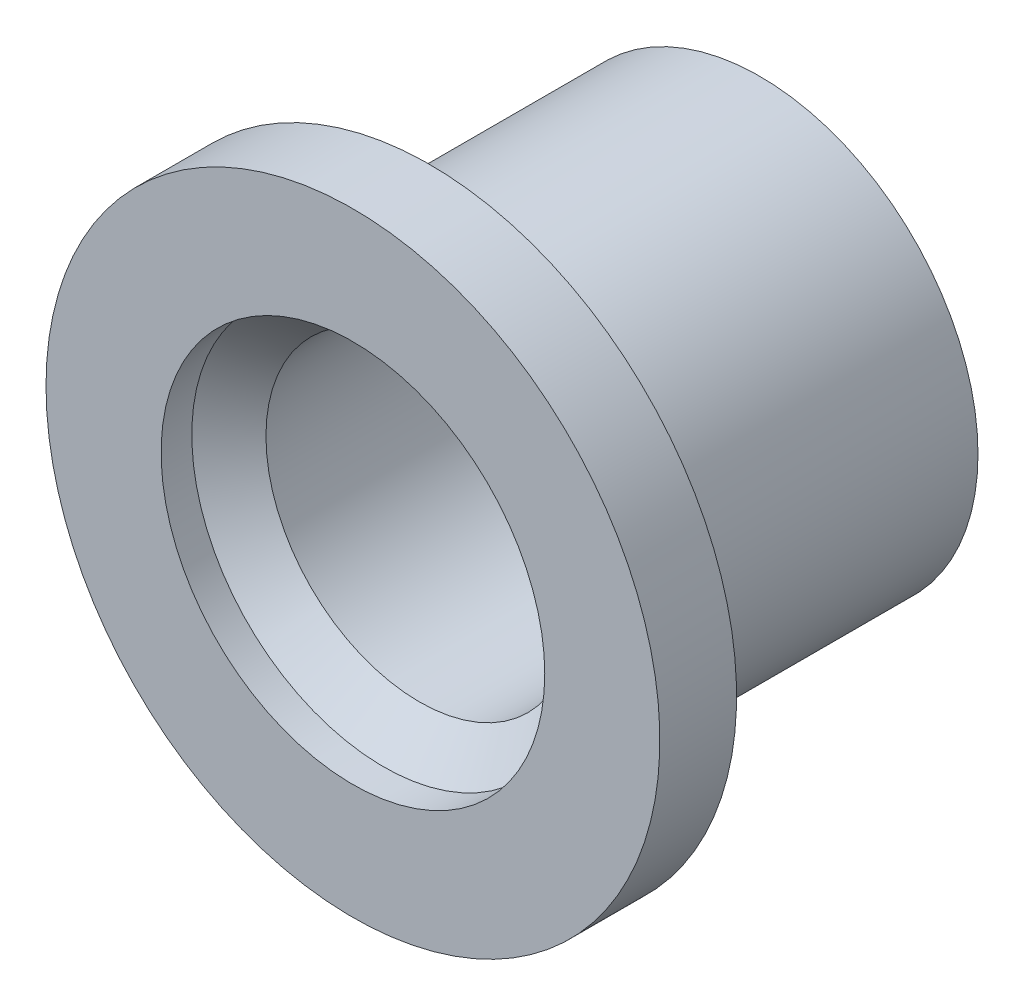
ISO-10303-21;
HEADER;
FILE_DESCRIPTION(('STEP AP214'),'2;1');
FILE_NAME('part.step','',(''),(''),'','','');
FILE_SCHEMA(('AUTOMOTIVE_DESIGN { 1 0 10303 214 1 1 1 1 }'));
ENDSEC;
DATA;
#1=APPLICATION_CONTEXT('core data for automotive mechanical design processes');
#2=APPLICATION_PROTOCOL_DEFINITION('international standard','automotive_design',2000,#1);
#3=PRODUCT_CONTEXT('',#1,'mechanical');
#4=PRODUCT('Part','Part','',(#3));
#5=PRODUCT_RELATED_PRODUCT_CATEGORY('part','',(#4));
#6=PRODUCT_DEFINITION_FORMATION('','',#4);
#7=PRODUCT_DEFINITION_CONTEXT('part definition',#1,'design');
#8=PRODUCT_DEFINITION('design','',#6,#7);
#9=PRODUCT_DEFINITION_SHAPE('','',#8);
#10=(LENGTH_UNIT() NAMED_UNIT(*) SI_UNIT(.MILLI.,.METRE.));
#11=(NAMED_UNIT(*) PLANE_ANGLE_UNIT() SI_UNIT($,.RADIAN.));
#12=(NAMED_UNIT(*) SI_UNIT($,.STERADIAN.) SOLID_ANGLE_UNIT());
#13=UNCERTAINTY_MEASURE_WITH_UNIT(LENGTH_MEASURE(1.E-05),#10,'distance_accuracy_value','');
#14=(GEOMETRIC_REPRESENTATION_CONTEXT(3) GLOBAL_UNCERTAINTY_ASSIGNED_CONTEXT((#13)) GLOBAL_UNIT_ASSIGNED_CONTEXT((#10,
#11,#12)) REPRESENTATION_CONTEXT('',''));
#15=CARTESIAN_POINT('',(0.,0.,0.));
#16=DIRECTION('',(0.,0.,1.));
#17=DIRECTION('',(1.,0.,0.));
#18=AXIS2_PLACEMENT_3D('',#15,#16,#17);
#19=CARTESIAN_POINT('',(0.,0.,0.));
#20=DIRECTION('',(0.,0.,1.));
#21=DIRECTION('',(1.,0.,0.));
#22=AXIS2_PLACEMENT_3D('',#19,#20,#21);
#23=PLANE('',#22);
#24=CARTESIAN_POINT('',(0.,0.,0.));
#25=DIRECTION('',(0.,0.,1.));
#26=DIRECTION('',(1.,0.,0.));
#27=AXIS2_PLACEMENT_3D('',#24,#25,#26);
#28=CIRCLE('',#27,5.08);
#29=CARTESIAN_POINT('',(-5.08,0.,0.));
#30=VERTEX_POINT('',#29);
#31=EDGE_CURVE('E48',#30,#30,#28,.T.);
#32=ORIENTED_EDGE('',*,*,#31,.F.);
#33=EDGE_LOOP('',(#32));
#34=FACE_BOUND('',#33,.T.);
#35=CARTESIAN_POINT('',(0.,0.,0.));
#36=DIRECTION('',(0.,0.,1.));
#37=DIRECTION('',(1.,0.,0.));
#38=AXIS2_PLACEMENT_3D('',#35,#36,#37);
#39=CIRCLE('',#38,3.60939766381894);
#40=CARTESIAN_POINT('',(3.60939766381894,0.,0.));
#41=VERTEX_POINT('',#40);
#42=EDGE_CURVE('E11',#41,#41,#39,.F.);
#43=ORIENTED_EDGE('',*,*,#42,.F.);
#44=EDGE_LOOP('',(#43));
#45=FACE_BOUND('',#44,.T.);
#46=ADVANCED_FACE('F33',(#34,#45),#23,.F.);
#47=CARTESIAN_POINT('',(0.,0.,0.762));
#48=DIRECTION('',(0.,0.,-1.));
#49=DIRECTION('',(-1.,0.,0.));
#50=AXIS2_PLACEMENT_3D('',#47,#48,#49);
#51=CYLINDRICAL_SURFACE('',#50,5.08);
#52=CARTESIAN_POINT('',(0.,0.,1.27));
#53=DIRECTION('',(0.,0.,1.));
#54=DIRECTION('',(1.,0.,0.));
#55=AXIS2_PLACEMENT_3D('',#52,#53,#54);
#56=CIRCLE('',#55,5.08);
#57=CARTESIAN_POINT('',(-5.08,0.,1.27));
#58=VERTEX_POINT('',#57);
#59=EDGE_CURVE('E53',#58,#58,#56,.T.);
#60=CARTESIAN_POINT('',(-5.08,0.,0.));
#61=CARTESIAN_POINT('',(-5.08,0.,0.0132291666666667));
#62=CARTESIAN_POINT('',(-5.08,0.,0.0264583333333333));
#63=CARTESIAN_POINT('',(-5.08,0.,0.0529166666666667));
#64=CARTESIAN_POINT('',(-5.08,0.,0.0661458333333333));
#65=CARTESIAN_POINT('',(-5.08,0.,0.0926041666666667));
#66=CARTESIAN_POINT('',(-5.08,0.,0.105833333333333));
#67=CARTESIAN_POINT('',(-5.08,0.,0.132291666666667));
#68=CARTESIAN_POINT('',(-5.08,0.,0.145520833333333));
#69=CARTESIAN_POINT('',(-5.08,0.,0.171979166666667));
#70=CARTESIAN_POINT('',(-5.08,0.,0.185208333333333));
#71=CARTESIAN_POINT('',(-5.08,0.,0.211666666666667));
#72=CARTESIAN_POINT('',(-5.08,0.,0.224895833333333));
#73=CARTESIAN_POINT('',(-5.08,0.,0.251354166666667));
#74=CARTESIAN_POINT('',(-5.08,0.,0.264583333333333));
#75=CARTESIAN_POINT('',(-5.08,0.,0.291041666666667));
#76=CARTESIAN_POINT('',(-5.08,0.,0.304270833333333));
#77=CARTESIAN_POINT('',(-5.08,0.,0.330729166666667));
#78=CARTESIAN_POINT('',(-5.08,0.,0.343958333333333));
#79=CARTESIAN_POINT('',(-5.08,0.,0.370416666666667));
#80=CARTESIAN_POINT('',(-5.08,0.,0.383645833333333));
#81=CARTESIAN_POINT('',(-5.08,0.,0.410104166666667));
#82=CARTESIAN_POINT('',(-5.08,0.,0.423333333333333));
#83=CARTESIAN_POINT('',(-5.08,0.,0.449791666666667));
#84=CARTESIAN_POINT('',(-5.08,0.,0.463020833333333));
#85=CARTESIAN_POINT('',(-5.08,0.,0.489479166666667));
#86=CARTESIAN_POINT('',(-5.08,0.,0.502708333333333));
#87=CARTESIAN_POINT('',(-5.08,0.,0.529166666666666));
#88=CARTESIAN_POINT('',(-5.08,0.,0.542395833333333));
#89=CARTESIAN_POINT('',(-5.08,0.,0.568854166666667));
#90=CARTESIAN_POINT('',(-5.08,0.,0.582083333333333));
#91=CARTESIAN_POINT('',(-5.08,0.,0.608541666666667));
#92=CARTESIAN_POINT('',(-5.08,0.,0.621770833333333));
#93=CARTESIAN_POINT('',(-5.08,0.,0.648229166666667));
#94=CARTESIAN_POINT('',(-5.08,0.,0.661458333333333));
#95=CARTESIAN_POINT('',(-5.08,0.,0.687916666666667));
#96=CARTESIAN_POINT('',(-5.08,0.,0.701145833333333));
#97=CARTESIAN_POINT('',(-5.08,0.,0.727604166666666));
#98=CARTESIAN_POINT('',(-5.08,0.,0.740833333333333));
#99=CARTESIAN_POINT('',(-5.08,0.,0.767291666666667));
#100=CARTESIAN_POINT('',(-5.08,0.,0.780520833333333));
#101=CARTESIAN_POINT('',(-5.08,0.,0.806979166666666));
#102=CARTESIAN_POINT('',(-5.08,0.,0.820208333333333));
#103=CARTESIAN_POINT('',(-5.08,0.,0.846666666666666));
#104=CARTESIAN_POINT('',(-5.08,0.,0.859895833333333));
#105=CARTESIAN_POINT('',(-5.08,0.,0.886354166666666));
#106=CARTESIAN_POINT('',(-5.08,0.,0.899583333333333));
#107=CARTESIAN_POINT('',(-5.08,0.,0.926041666666666));
#108=CARTESIAN_POINT('',(-5.08,0.,0.939270833333333));
#109=CARTESIAN_POINT('',(-5.08,0.,0.965729166666666));
#110=CARTESIAN_POINT('',(-5.08,0.,0.978958333333333));
#111=CARTESIAN_POINT('',(-5.08,0.,1.00541666666667));
#112=CARTESIAN_POINT('',(-5.08,0.,1.01864583333333));
#113=CARTESIAN_POINT('',(-5.08,0.,1.04510416666667));
#114=CARTESIAN_POINT('',(-5.08,0.,1.05833333333333));
#115=CARTESIAN_POINT('',(-5.08,0.,1.08479166666667));
#116=CARTESIAN_POINT('',(-5.08,0.,1.09802083333333));
#117=CARTESIAN_POINT('',(-5.08,0.,1.12447916666667));
#118=CARTESIAN_POINT('',(-5.08,0.,1.13770833333333));
#119=CARTESIAN_POINT('',(-5.08,0.,1.16416666666667));
#120=CARTESIAN_POINT('',(-5.08,0.,1.17739583333333));
#121=CARTESIAN_POINT('',(-5.08,0.,1.20385416666667));
#122=CARTESIAN_POINT('',(-5.08,0.,1.21708333333333));
#123=CARTESIAN_POINT('',(-5.08,0.,1.24354166666667));
#124=CARTESIAN_POINT('',(-5.08,0.,1.25677083333333));
#125=CARTESIAN_POINT('',(-5.08,0.,1.27));
#126=B_SPLINE_CURVE_WITH_KNOTS('',3,(#60,#61,#62,#63,#64,#65,#66,#67,#68,#69,#70,#71,#72,#73,
#74,#75,#76,#77,#78,#79,#80,#81,#82,#83,#84,#85,#86,#87,#88,#89,#90,#91,#92,#93,#94,#95,#96,#97,
#98,#99,#100,#101,#102,#103,#104,#105,#106,#107,#108,#109,#110,#111,#112,#113,#114,#115,#116,
#117,#118,#119,#120,#121,#122,#123,#124,#125),.UNSPECIFIED.,.F.,.F.,(4,2,2,2,2,2,2,2,2,2,2,2,2,
2,2,2,2,2,2,2,2,2,2,2,2,2,2,2,2,2,2,2,4),(0.,0.0396875,0.079375,0.1190625,0.15875,0.1984375,
0.238125,0.2778125,0.3175,0.3571875,0.396875,0.4365625,0.47625,0.5159375,0.555625,0.5953125,
0.635,0.6746875,0.714375,0.7540625,0.79375,0.8334375,0.873125,0.9128125,0.9525,0.9921875,
1.031875,1.0715625,1.11125,1.1509375,1.190625,1.2303125,1.27),.UNSPECIFIED.);
#127=EDGE_CURVE('BSEAM79',#30,#58,#126,.T.);
#128=ORIENTED_EDGE('',*,*,#31,.T.);
#129=ORIENTED_EDGE('',*,*,#59,.F.);
#130=ORIENTED_EDGE('',*,*,#127,.T.);
#131=ORIENTED_EDGE('',*,*,#127,.F.);
#132=EDGE_LOOP('',(#128,#130,#129,#131));
#133=FACE_BOUND('',#132,.T.);
#134=ADVANCED_FACE('F79',(#133),#51,.T.);
#135=CARTESIAN_POINT('',(0.,0.,0.762));
#136=DIRECTION('',(0.,0.,-1.));
#137=DIRECTION('',(-1.,0.,0.));
#138=AXIS2_PLACEMENT_3D('',#135,#136,#137);
#139=CYLINDRICAL_SURFACE('',#138,2.54);
#140=CARTESIAN_POINT('',(0.,0.,0.169852920302577));
#141=DIRECTION('',(0.,0.,1.));
#142=DIRECTION('',(1.,0.,0.));
#143=AXIS2_PLACEMENT_3D('',#140,#141,#142);
#144=CIRCLE('',#143,2.54);
#145=CARTESIAN_POINT('',(-2.54,0.,0.169852920302577));
#146=VERTEX_POINT('',#145);
#147=EDGE_CURVE('E44',#146,#146,#144,.T.);
#148=CARTESIAN_POINT('',(0.,0.,-5.46608));
#149=DIRECTION('',(0.,0.,1.));
#150=DIRECTION('',(1.,0.,0.));
#151=AXIS2_PLACEMENT_3D('',#148,#149,#150);
#152=CIRCLE('',#151,2.54);
#153=CARTESIAN_POINT('',(-2.54,0.,-5.46608));
#154=VERTEX_POINT('',#153);
#155=EDGE_CURVE('E59',#154,#154,#152,.T.);
#156=CARTESIAN_POINT('',(-2.54,0.,0.169852920302577));
#157=CARTESIAN_POINT('',(-2.54,0.,0.111145285716092));
#158=CARTESIAN_POINT('',(-2.54,0.,0.0524376511296068));
#159=CARTESIAN_POINT('',(-2.54,0.,-0.0649776180433636));
#160=CARTESIAN_POINT('',(-2.54,0.,-0.123685252629849));
#161=CARTESIAN_POINT('',(-2.54,0.,-0.241100521802819));
#162=CARTESIAN_POINT('',(-2.54,0.,-0.299808156389304));
#163=CARTESIAN_POINT('',(-2.54,0.,-0.417223425562275));
#164=CARTESIAN_POINT('',(-2.54,0.,-0.47593106014876));
#165=CARTESIAN_POINT('',(-2.54,0.,-0.593346329321731));
#166=CARTESIAN_POINT('',(-2.54,0.,-0.652053963908216));
#167=CARTESIAN_POINT('',(-2.54,0.,-0.769469233081186));
#168=CARTESIAN_POINT('',(-2.54,0.,-0.828176867667671));
#169=CARTESIAN_POINT('',(-2.54,0.,-0.945592136840642));
#170=CARTESIAN_POINT('',(-2.54,0.,-1.00429977142713));
#171=CARTESIAN_POINT('',(-2.54,0.,-1.1217150406001));
#172=CARTESIAN_POINT('',(-2.54,0.,-1.18042267518658));
#173=CARTESIAN_POINT('',(-2.54,0.,-1.29783794435955));
#174=CARTESIAN_POINT('',(-2.54,0.,-1.35654557894604));
#175=CARTESIAN_POINT('',(-2.54,0.,-1.47396084811901));
#176=CARTESIAN_POINT('',(-2.54,0.,-1.53266848270549));
#177=CARTESIAN_POINT('',(-2.54,0.,-1.65008375187846));
#178=CARTESIAN_POINT('',(-2.54,0.,-1.70879138646495));
#179=CARTESIAN_POINT('',(-2.54,0.,-1.82620665563792));
#180=CARTESIAN_POINT('',(-2.54,0.,-1.88491429022441));
#181=CARTESIAN_POINT('',(-2.54,0.,-2.00232955939738));
#182=CARTESIAN_POINT('',(-2.54,0.,-2.06103719398386));
#183=CARTESIAN_POINT('',(-2.54,0.,-2.17845246315683));
#184=CARTESIAN_POINT('',(-2.54,0.,-2.23716009774332));
#185=CARTESIAN_POINT('',(-2.54,0.,-2.35457536691629));
#186=CARTESIAN_POINT('',(-2.54,0.,-2.41328300150277));
#187=CARTESIAN_POINT('',(-2.54,0.,-2.53069827067574));
#188=CARTESIAN_POINT('',(-2.54,0.,-2.58940590526223));
#189=CARTESIAN_POINT('',(-2.54,0.,-2.7068211744352));
#190=CARTESIAN_POINT('',(-2.54,0.,-2.76552880902168));
#191=CARTESIAN_POINT('',(-2.54,0.,-2.88294407819465));
#192=CARTESIAN_POINT('',(-2.54,0.,-2.94165171278114));
#193=CARTESIAN_POINT('',(-2.54,0.,-3.05906698195411));
#194=CARTESIAN_POINT('',(-2.54,0.,-3.11777461654059));
#195=CARTESIAN_POINT('',(-2.54,0.,-3.23518988571356));
#196=CARTESIAN_POINT('',(-2.54,0.,-3.29389752030005));
#197=CARTESIAN_POINT('',(-2.54,0.,-3.41131278947302));
#198=CARTESIAN_POINT('',(-2.54,0.,-3.47002042405951));
#199=CARTESIAN_POINT('',(-2.54,0.,-3.58743569323248));
#200=CARTESIAN_POINT('',(-2.54,0.,-3.64614332781896));
#201=CARTESIAN_POINT('',(-2.54,0.,-3.76355859699193));
#202=CARTESIAN_POINT('',(-2.54,0.,-3.82226623157842));
#203=CARTESIAN_POINT('',(-2.54,0.,-3.93968150075139));
#204=CARTESIAN_POINT('',(-2.54,0.,-3.99838913533787));
#205=CARTESIAN_POINT('',(-2.54,0.,-4.11580440451084));
#206=CARTESIAN_POINT('',(-2.54,0.,-4.17451203909733));
#207=CARTESIAN_POINT('',(-2.54,0.,-4.2919273082703));
#208=CARTESIAN_POINT('',(-2.54,0.,-4.35063494285678));
#209=CARTESIAN_POINT('',(-2.54,0.,-4.46805021202975));
#210=CARTESIAN_POINT('',(-2.54,0.,-4.52675784661624));
#211=CARTESIAN_POINT('',(-2.54,0.,-4.64417311578921));
#212=CARTESIAN_POINT('',(-2.54,0.,-4.7028807503757));
#213=CARTESIAN_POINT('',(-2.54,0.,-4.82029601954867));
#214=CARTESIAN_POINT('',(-2.54,0.,-4.87900365413515));
#215=CARTESIAN_POINT('',(-2.54,0.,-4.99641892330812));
#216=CARTESIAN_POINT('',(-2.54,0.,-5.05512655789461));
#217=CARTESIAN_POINT('',(-2.54,0.,-5.17254182706758));
#218=CARTESIAN_POINT('',(-2.54,0.,-5.23124946165406));
#219=CARTESIAN_POINT('',(-2.54,0.,-5.34866473082703));
#220=CARTESIAN_POINT('',(-2.54,0.,-5.40737236541352));
#221=CARTESIAN_POINT('',(-2.54,0.,-5.46608));
#222=B_SPLINE_CURVE_WITH_KNOTS('',3,(#156,#157,#158,#159,#160,#161,#162,#163,#164,#165,#166,
#167,#168,#169,#170,#171,#172,#173,#174,#175,#176,#177,#178,#179,#180,#181,#182,#183,#184,#185,
#186,#187,#188,#189,#190,#191,#192,#193,#194,#195,#196,#197,#198,#199,#200,#201,#202,#203,#204,
#205,#206,#207,#208,#209,#210,#211,#212,#213,#214,#215,#216,#217,#218,#219,#220,#221),
.UNSPECIFIED.,.F.,.F.,(4,2,2,2,2,2,2,2,2,2,2,2,2,2,2,2,2,2,2,2,2,2,2,2,2,2,2,2,2,2,2,2,4),(0.,
0.176122903759456,0.352245807518911,0.528368711278367,0.704491615037823,0.880614518797278,
1.05673742255673,1.23286032631619,1.40898323007564,1.5851061338351,1.76122903759456,
1.93735194135401,2.11347484511347,2.28959774887292,2.46572065263238,2.64184355639183,
2.81796646015129,2.99408936391075,3.1702122676702,3.34633517142966,3.52245807518911,
3.69858097894857,3.87470388270802,4.05082678646748,4.22694969022694,4.40307259398639,
4.57919549774585,4.7553184015053,4.93144130526476,5.10756420902421,5.28368711278367,
5.45981001654312,5.63593292030258),.UNSPECIFIED.);
#223=EDGE_CURVE('BSEAM87',#146,#154,#222,.T.);
#224=ORIENTED_EDGE('',*,*,#147,.T.);
#225=ORIENTED_EDGE('',*,*,#155,.F.);
#226=ORIENTED_EDGE('',*,*,#223,.T.);
#227=ORIENTED_EDGE('',*,*,#223,.F.);
#228=EDGE_LOOP('',(#224,#226,#225,#227));
#229=FACE_BOUND('',#228,.T.);
#230=ADVANCED_FACE('F87',(#229),#139,.F.);
#231=CARTESIAN_POINT('',(0.,0.,0.169852920302577));
#232=DIRECTION('',(0.,0.,1.));
#233=DIRECTION('',(1.,0.,0.));
#234=AXIS2_PLACEMENT_3D('',#231,#232,#233);
#235=CONICAL_SURFACE('',#234,2.54,0.820304748437337);
#236=CARTESIAN_POINT('',(0.,0.,0.762));
#237=DIRECTION('',(0.,0.,1.));
#238=DIRECTION('',(1.,0.,0.));
#239=AXIS2_PLACEMENT_3D('',#236,#237,#238);
#240=CIRCLE('',#239,3.17500000000001);
#241=CARTESIAN_POINT('',(3.17500000000001,0.,0.762));
#242=VERTEX_POINT('',#241);
#243=EDGE_CURVE('E40',#242,#242,#240,.F.);
#244=ORIENTED_EDGE('',*,*,#243,.F.);
#245=EDGE_LOOP('',(#244));
#246=FACE_BOUND('',#245,.T.);
#247=ORIENTED_EDGE('',*,*,#147,.F.);
#248=EDGE_LOOP('',(#247));
#249=FACE_BOUND('',#248,.T.);
#250=ADVANCED_FACE('F35',(#246,#249),#235,.F.);
#251=CARTESIAN_POINT('',(0.,0.,1.27));
#252=DIRECTION('',(0.,0.,1.));
#253=DIRECTION('',(1.,0.,0.));
#254=AXIS2_PLACEMENT_3D('',#251,#252,#253);
#255=PLANE('',#254);
#256=ORIENTED_EDGE('',*,*,#59,.T.);
#257=EDGE_LOOP('',(#256));
#258=FACE_BOUND('',#257,.T.);
#259=CARTESIAN_POINT('',(0.,0.,1.27));
#260=DIRECTION('',(0.,0.,1.));
#261=DIRECTION('',(1.,0.,0.));
#262=AXIS2_PLACEMENT_3D('',#259,#260,#261);
#263=CIRCLE('',#262,3.175);
#264=CARTESIAN_POINT('',(3.175,0.,1.27));
#265=VERTEX_POINT('',#264);
#266=EDGE_CURVE('E56',#265,#265,#263,.T.);
#267=ORIENTED_EDGE('',*,*,#266,.F.);
#268=EDGE_LOOP('',(#267));
#269=FACE_BOUND('',#268,.T.);
#270=ADVANCED_FACE('F95',(#258,#269),#255,.T.);
#271=CARTESIAN_POINT('',(0.,0.,1.27));
#272=DIRECTION('',(0.,0.,-1.));
#273=DIRECTION('',(-1.,0.,0.));
#274=AXIS2_PLACEMENT_3D('',#271,#272,#273);
#275=CYLINDRICAL_SURFACE('',#274,3.175);
#276=ORIENTED_EDGE('',*,*,#266,.T.);
#277=EDGE_LOOP('',(#276));
#278=FACE_BOUND('',#277,.T.);
#279=ORIENTED_EDGE('',*,*,#243,.T.);
#280=EDGE_LOOP('',(#279));
#281=FACE_BOUND('',#280,.T.);
#282=ADVANCED_FACE('F75',(#278,#281),#275,.F.);
#283=CARTESIAN_POINT('',(0.,0.,-15.801998256341));
#284=DIRECTION('',(0.,0.,1.));
#285=DIRECTION('',(1.,0.,0.));
#286=AXIS2_PLACEMENT_3D('',#283,#284,#285);
#287=CYLINDRICAL_SURFACE('',#286,3.60939766381894);
#288=CARTESIAN_POINT('',(0.,0.,-5.46608));
#289=DIRECTION('',(0.,0.,1.));
#290=DIRECTION('',(1.,0.,0.));
#291=AXIS2_PLACEMENT_3D('',#288,#289,#290);
#292=CIRCLE('',#291,3.60939766381894);
#293=CARTESIAN_POINT('',(3.60939766381894,0.,-5.46608));
#294=VERTEX_POINT('',#293);
#295=EDGE_CURVE('E62',#294,#294,#292,.T.);
#296=ORIENTED_EDGE('',*,*,#295,.T.);
#297=EDGE_LOOP('',(#296));
#298=FACE_BOUND('',#297,.T.);
#299=ORIENTED_EDGE('',*,*,#42,.T.);
#300=EDGE_LOOP('',(#299));
#301=FACE_BOUND('',#300,.T.);
#302=ADVANCED_FACE('F66',(#298,#301),#287,.T.);
#303=CARTESIAN_POINT('',(0.,0.,-5.46608));
#304=DIRECTION('',(0.,0.,1.));
#305=DIRECTION('',(0.467937795369549,0.883761404262874,0.));
#306=AXIS2_PLACEMENT_3D('',#303,#304,#305);
#307=PLANE('',#306);
#308=ORIENTED_EDGE('',*,*,#155,.T.);
#309=EDGE_LOOP('',(#308));
#310=FACE_BOUND('',#309,.T.);
#311=ORIENTED_EDGE('',*,*,#295,.F.);
#312=EDGE_LOOP('',(#311));
#313=FACE_BOUND('',#312,.T.);
#314=ADVANCED_FACE('F68',(#310,#313),#307,.F.);
#315=CLOSED_SHELL('',(#46,#134,#230,#250,#270,#282,#302,#314));
#316=MANIFOLD_SOLID_BREP('B2',#315);
#317=ADVANCED_BREP_SHAPE_REPRESENTATION('',(#18,#316),#14);
#318=SHAPE_DEFINITION_REPRESENTATION(#9,#317);
ENDSEC;
END-ISO-10303-21;
